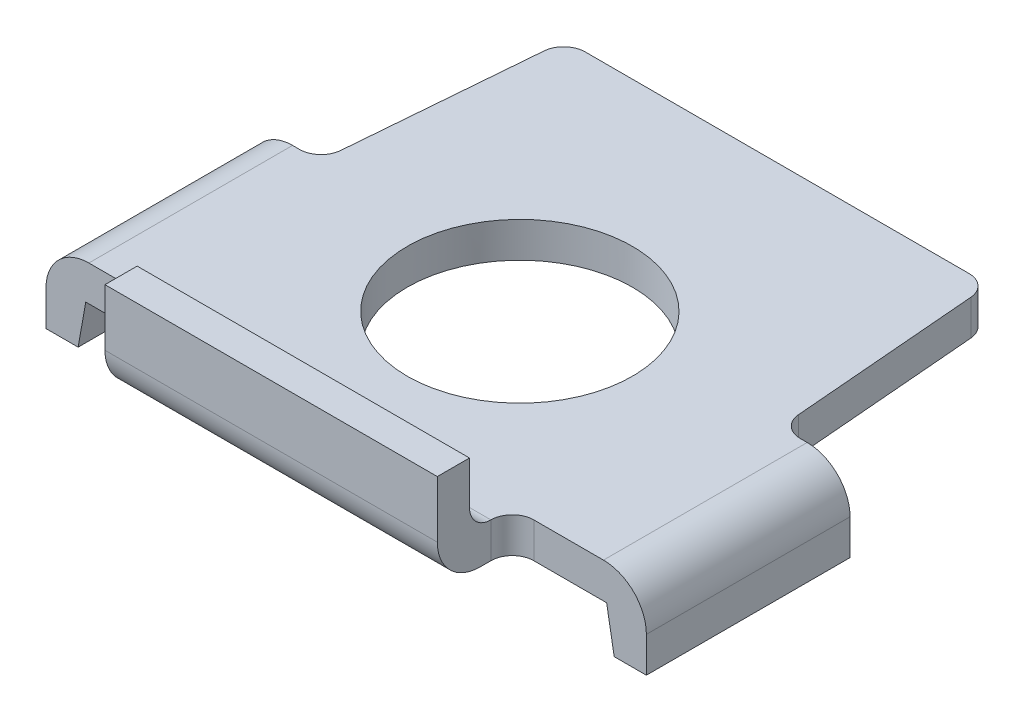
ISO-10303-21;
HEADER;
FILE_DESCRIPTION(('STEP AP214'),'2;1');
FILE_NAME('part.step','',(''),(''),'','','');
FILE_SCHEMA(('AUTOMOTIVE_DESIGN { 1 0 10303 214 1 1 1 1 }'));
ENDSEC;
DATA;
#1=APPLICATION_CONTEXT('core data for automotive mechanical design processes');
#2=APPLICATION_PROTOCOL_DEFINITION('international standard','automotive_design',2000,#1);
#3=PRODUCT_CONTEXT('',#1,'mechanical');
#4=PRODUCT('Part','Part','',(#3));
#5=PRODUCT_RELATED_PRODUCT_CATEGORY('part','',(#4));
#6=PRODUCT_DEFINITION_FORMATION('','',#4);
#7=PRODUCT_DEFINITION_CONTEXT('part definition',#1,'design');
#8=PRODUCT_DEFINITION('design','',#6,#7);
#9=PRODUCT_DEFINITION_SHAPE('','',#8);
#10=(LENGTH_UNIT() NAMED_UNIT(*) SI_UNIT(.MILLI.,.METRE.));
#11=(NAMED_UNIT(*) PLANE_ANGLE_UNIT() SI_UNIT($,.RADIAN.));
#12=(NAMED_UNIT(*) SI_UNIT($,.STERADIAN.) SOLID_ANGLE_UNIT());
#13=UNCERTAINTY_MEASURE_WITH_UNIT(LENGTH_MEASURE(1.E-05),#10,'distance_accuracy_value','');
#14=(GEOMETRIC_REPRESENTATION_CONTEXT(3) GLOBAL_UNCERTAINTY_ASSIGNED_CONTEXT((#13)) GLOBAL_UNIT_ASSIGNED_CONTEXT((#10,
#11,#12)) REPRESENTATION_CONTEXT('',''));
#15=CARTESIAN_POINT('',(0.,0.,0.));
#16=DIRECTION('',(0.,0.,1.));
#17=DIRECTION('',(1.,0.,0.));
#18=AXIS2_PLACEMENT_3D('',#15,#16,#17);
#19=CARTESIAN_POINT('',(0.,0.,0.));
#20=DIRECTION('',(0.,-1.,0.));
#21=DIRECTION('',(0.,0.,-1.));
#22=AXIS2_PLACEMENT_3D('',#19,#20,#21);
#23=PLANE('',#22);
#24=CARTESIAN_POINT('',(0.,0.,9.89913443976813));
#25=DIRECTION('',(0.,-1.,0.));
#26=DIRECTION('',(0.,0.,-1.));
#27=AXIS2_PLACEMENT_3D('',#24,#25,#26);
#28=CIRCLE('',#27,5.25);
#29=CARTESIAN_POINT('',(0.,0.,4.64913443976813));
#30=VERTEX_POINT('',#29);
#31=EDGE_CURVE('E241',#30,#30,#28,.T.);
#32=ORIENTED_EDGE('',*,*,#31,.F.);
#33=EDGE_LOOP('',(#32));
#34=FACE_BOUND('',#33,.T.);
#35=DIRECTION('',(-1.,0.,0.));
#36=VECTOR('',#35,1.);
#37=CARTESIAN_POINT('',(-9.875,0.,-2.10086556023187));
#38=LINE('',#37,#36);
#39=CARTESIAN_POINT('',(8.9541459363838,0.,-2.10086556023187));
#40=VERTEX_POINT('',#39);
#41=CARTESIAN_POINT('',(-8.95414593638381,0.,-2.10086556023187));
#42=VERTEX_POINT('',#41);
#43=EDGE_CURVE('E303',#40,#42,#38,.T.);
#44=ORIENTED_EDGE('',*,*,#43,.F.);
#45=CARTESIAN_POINT('',(8.9541459363838,0.,-1.10086556023187));
#46=DIRECTION('',(0.,-1.,0.));
#47=DIRECTION('',(0.,0.,-1.));
#48=AXIS2_PLACEMENT_3D('',#45,#46,#47);
#49=CIRCLE('',#48,1.);
#50=CARTESIAN_POINT('',(9.9507562321317,0.,-1.18313291955068));
#51=VERTEX_POINT('',#50);
#52=EDGE_CURVE('E409',#40,#51,#49,.T.);
#53=ORIENTED_EDGE('',*,*,#52,.T.);
#54=DIRECTION('',(-0.0822673593188121,0.,-0.996610295747897));
#55=VECTOR('',#54,1.);
#56=CARTESIAN_POINT('',(9.875,0.,-2.10086556023187));
#57=LINE('',#56,#55);
#58=CARTESIAN_POINT('',(10.6742437678683,0.,7.58140179908695));
#59=VERTEX_POINT('',#58);
#60=EDGE_CURVE('E301',#59,#51,#57,.T.);
#61=ORIENTED_EDGE('',*,*,#60,.F.);
#62=CARTESIAN_POINT('',(11.6708540636162,0.,7.49913443976813));
#63=DIRECTION('',(0.,-1.,0.));
#64=DIRECTION('',(0.,0.,-1.));
#65=AXIS2_PLACEMENT_3D('',#62,#63,#64);
#66=CIRCLE('',#65,1.);
#67=CARTESIAN_POINT('',(11.6708540636162,0.,8.49913443976813));
#68=VERTEX_POINT('',#67);
#69=EDGE_CURVE('E41',#59,#68,#66,.F.);
#70=ORIENTED_EDGE('',*,*,#69,.T.);
#71=DIRECTION('',(-1.,0.,0.));
#72=VECTOR('',#71,1.);
#73=CARTESIAN_POINT('',(10.75,0.,8.49913443976813));
#74=LINE('',#73,#72);
#75=CARTESIAN_POINT('',(12.1473460385831,0.,8.49913443976813));
#76=VERTEX_POINT('',#75);
#77=EDGE_CURVE('E299',#76,#68,#74,.T.);
#78=ORIENTED_EDGE('',*,*,#77,.F.);
#79=DIRECTION('',(0.,0.,1.));
#80=VECTOR('',#79,1.);
#81=CARTESIAN_POINT('',(12.1473460385831,0.,0.));
#82=LINE('',#81,#80);
#83=CARTESIAN_POINT('',(12.1473460385831,0.,17.9991344397681));
#84=VERTEX_POINT('',#83);
#85=EDGE_CURVE('E478',#76,#84,#82,.T.);
#86=ORIENTED_EDGE('',*,*,#85,.T.);
#87=DIRECTION('',(1.,0.,0.));
#88=VECTOR('',#87,1.);
#89=CARTESIAN_POINT('',(14.,0.,17.9991344397681));
#90=LINE('',#89,#88);
#91=CARTESIAN_POINT('',(8.75,0.,17.9991344397681));
#92=VERTEX_POINT('',#91);
#93=EDGE_CURVE('E297',#92,#84,#90,.T.);
#94=ORIENTED_EDGE('',*,*,#93,.F.);
#95=CARTESIAN_POINT('',(8.75,0.,18.9991344397681));
#96=DIRECTION('',(0.,-1.,0.));
#97=DIRECTION('',(0.,0.,-1.));
#98=AXIS2_PLACEMENT_3D('',#95,#96,#97);
#99=CIRCLE('',#98,1.);
#100=CARTESIAN_POINT('',(7.75,0.,18.9991344397681));
#101=VERTEX_POINT('',#100);
#102=EDGE_CURVE('E345',#92,#101,#99,.F.);
#103=ORIENTED_EDGE('',*,*,#102,.T.);
#104=DIRECTION('',(0.,0.,-1.));
#105=VECTOR('',#104,1.);
#106=CARTESIAN_POINT('',(7.75000000000001,0.,17.9991344397681));
#107=LINE('',#106,#105);
#108=CARTESIAN_POINT('',(7.75,0.,19.4991344397681));
#109=VERTEX_POINT('',#108);
#110=EDGE_CURVE('E293',#109,#101,#107,.T.);
#111=ORIENTED_EDGE('',*,*,#110,.F.);
#112=DIRECTION('',(1.,0.,0.));
#113=VECTOR('',#112,1.);
#114=CARTESIAN_POINT('',(-7.75,0.,19.4991344397681));
#115=LINE('',#114,#113);
#116=CARTESIAN_POINT('',(-7.75,0.,19.4991344397681));
#117=VERTEX_POINT('',#116);
#118=EDGE_CURVE('E376',#109,#117,#115,.F.);
#119=ORIENTED_EDGE('',*,*,#118,.T.);
#120=DIRECTION('',(0.,0.,1.));
#121=VECTOR('',#120,1.);
#122=CARTESIAN_POINT('',(-7.75000000000001,0.,17.9991344397681));
#123=LINE('',#122,#121);
#124=CARTESIAN_POINT('',(-7.75,0.,18.9991344397681));
#125=VERTEX_POINT('',#124);
#126=EDGE_CURVE('E291',#125,#117,#123,.T.);
#127=ORIENTED_EDGE('',*,*,#126,.F.);
#128=CARTESIAN_POINT('',(-8.75,0.,18.9991344397681));
#129=DIRECTION('',(0.,-1.,0.));
#130=DIRECTION('',(0.,0.,-1.));
#131=AXIS2_PLACEMENT_3D('',#128,#129,#130);
#132=CIRCLE('',#131,1.);
#133=CARTESIAN_POINT('',(-8.75,0.,17.9991344397681));
#134=VERTEX_POINT('',#133);
#135=EDGE_CURVE('E341',#125,#134,#132,.F.);
#136=ORIENTED_EDGE('',*,*,#135,.T.);
#137=DIRECTION('',(1.,0.,0.));
#138=VECTOR('',#137,1.);
#139=CARTESIAN_POINT('',(-14.,0.,17.9991344397681));
#140=LINE('',#139,#138);
#141=CARTESIAN_POINT('',(-12.1473460385831,0.,17.9991344397681));
#142=VERTEX_POINT('',#141);
#143=EDGE_CURVE('E276',#142,#134,#140,.T.);
#144=ORIENTED_EDGE('',*,*,#143,.F.);
#145=DIRECTION('',(0.,0.,-1.));
#146=VECTOR('',#145,1.);
#147=CARTESIAN_POINT('',(-12.1473460385831,0.,0.));
#148=LINE('',#147,#146);
#149=CARTESIAN_POINT('',(-12.1473460385831,0.,8.49913443976813));
#150=VERTEX_POINT('',#149);
#151=EDGE_CURVE('E451',#142,#150,#148,.T.);
#152=ORIENTED_EDGE('',*,*,#151,.T.);
#153=DIRECTION('',(-1.,0.,0.));
#154=VECTOR('',#153,1.);
#155=CARTESIAN_POINT('',(-10.75,0.,8.49913443976813));
#156=LINE('',#155,#154);
#157=CARTESIAN_POINT('',(-11.6708540636162,0.,8.49913443976813));
#158=VERTEX_POINT('',#157);
#159=EDGE_CURVE('E308',#158,#150,#156,.T.);
#160=ORIENTED_EDGE('',*,*,#159,.F.);
#161=CARTESIAN_POINT('',(-11.6708540636162,0.,7.49913443976813));
#162=DIRECTION('',(0.,-1.,0.));
#163=DIRECTION('',(0.,0.,-1.));
#164=AXIS2_PLACEMENT_3D('',#161,#162,#163);
#165=CIRCLE('',#164,1.);
#166=CARTESIAN_POINT('',(-10.6742437678683,0.,7.58140179908695));
#167=VERTEX_POINT('',#166);
#168=EDGE_CURVE('E337',#158,#167,#165,.F.);
#169=ORIENTED_EDGE('',*,*,#168,.T.);
#170=DIRECTION('',(-0.0822673593188121,0.,0.996610295747897));
#171=VECTOR('',#170,1.);
#172=CARTESIAN_POINT('',(-9.875,0.,-2.10086556023187));
#173=LINE('',#172,#171);
#174=CARTESIAN_POINT('',(-9.9507562321317,0.,-1.18313291955068));
#175=VERTEX_POINT('',#174);
#176=EDGE_CURVE('E305',#175,#167,#173,.T.);
#177=ORIENTED_EDGE('',*,*,#176,.F.);
#178=CARTESIAN_POINT('',(-8.95414593638381,0.,-1.10086556023187));
#179=DIRECTION('',(0.,-1.,0.));
#180=DIRECTION('',(0.,0.,-1.));
#181=AXIS2_PLACEMENT_3D('',#178,#179,#180);
#182=CIRCLE('',#181,1.);
#183=EDGE_CURVE('E398',#175,#42,#182,.T.);
#184=ORIENTED_EDGE('',*,*,#183,.T.);
#185=EDGE_LOOP('',(#44,#53,#61,#70,#78,#86,#94,#103,#111,#119,#127,#136,#144,#152,#160,#169,
#177,#184));
#186=FACE_BOUND('',#185,.T.);
#187=ADVANCED_FACE('F33',(#34,#186),#23,.T.);
#188=CARTESIAN_POINT('',(0.,1.65,0.));
#189=DIRECTION('',(0.,-1.,0.));
#190=DIRECTION('',(0.,0.,-1.));
#191=AXIS2_PLACEMENT_3D('',#188,#189,#190);
#192=PLANE('',#191);
#193=CARTESIAN_POINT('',(0.,1.65,9.89913443976813));
#194=DIRECTION('',(0.,1.,0.));
#195=DIRECTION('',(0.,0.,1.));
#196=AXIS2_PLACEMENT_3D('',#193,#194,#195);
#197=CIRCLE('',#196,5.25);
#198=CARTESIAN_POINT('',(0.,1.65,15.1491344397681));
#199=VERTEX_POINT('',#198);
#200=EDGE_CURVE('E244',#199,#199,#197,.T.);
#201=ORIENTED_EDGE('',*,*,#200,.F.);
#202=EDGE_LOOP('',(#201));
#203=FACE_BOUND('',#202,.T.);
#204=DIRECTION('',(-1.,0.,0.));
#205=VECTOR('',#204,1.);
#206=CARTESIAN_POINT('',(10.75,1.65,8.49913443976813));
#207=LINE('',#206,#205);
#208=CARTESIAN_POINT('',(12.,1.65,8.49913443976813));
#209=VERTEX_POINT('',#208);
#210=CARTESIAN_POINT('',(11.6708540636162,1.65,8.49913443976813));
#211=VERTEX_POINT('',#210);
#212=EDGE_CURVE('E275',#209,#211,#207,.T.);
#213=ORIENTED_EDGE('',*,*,#212,.T.);
#214=CARTESIAN_POINT('',(11.6708540636162,1.65,7.49913443976813));
#215=DIRECTION('',(0.,-1.,0.));
#216=DIRECTION('',(0.,0.,-1.));
#217=AXIS2_PLACEMENT_3D('',#214,#215,#216);
#218=CIRCLE('',#217,1.);
#219=CARTESIAN_POINT('',(10.6742437678683,1.65,7.58140179908695));
#220=VERTEX_POINT('',#219);
#221=EDGE_CURVE('E11',#211,#220,#218,.T.);
#222=ORIENTED_EDGE('',*,*,#221,.T.);
#223=DIRECTION('',(-0.0822673593188121,0.,-0.996610295747897));
#224=VECTOR('',#223,1.);
#225=CARTESIAN_POINT('',(9.875,1.65,-2.10086556023187));
#226=LINE('',#225,#224);
#227=CARTESIAN_POINT('',(9.9507562321317,1.65,-1.18313291955068));
#228=VERTEX_POINT('',#227);
#229=EDGE_CURVE('E278',#220,#228,#226,.T.);
#230=ORIENTED_EDGE('',*,*,#229,.T.);
#231=CARTESIAN_POINT('',(8.9541459363838,1.65,-1.10086556023187));
#232=DIRECTION('',(0.,-1.,0.));
#233=DIRECTION('',(0.,0.,-1.));
#234=AXIS2_PLACEMENT_3D('',#231,#232,#233);
#235=CIRCLE('',#234,1.);
#236=CARTESIAN_POINT('',(8.9541459363838,1.65,-2.10086556023187));
#237=VERTEX_POINT('',#236);
#238=EDGE_CURVE('E316',#228,#237,#235,.F.);
#239=ORIENTED_EDGE('',*,*,#238,.T.);
#240=DIRECTION('',(-1.,0.,0.));
#241=VECTOR('',#240,1.);
#242=CARTESIAN_POINT('',(-9.875,1.65,-2.10086556023187));
#243=LINE('',#242,#241);
#244=CARTESIAN_POINT('',(-8.95414593638381,1.65,-2.10086556023187));
#245=VERTEX_POINT('',#244);
#246=EDGE_CURVE('E280',#237,#245,#243,.T.);
#247=ORIENTED_EDGE('',*,*,#246,.T.);
#248=CARTESIAN_POINT('',(-8.95414593638381,1.65,-1.10086556023187));
#249=DIRECTION('',(0.,-1.,0.));
#250=DIRECTION('',(0.,0.,-1.));
#251=AXIS2_PLACEMENT_3D('',#248,#249,#250);
#252=CIRCLE('',#251,1.);
#253=CARTESIAN_POINT('',(-9.9507562321317,1.65,-1.18313291955068));
#254=VERTEX_POINT('',#253);
#255=EDGE_CURVE('E404',#245,#254,#252,.F.);
#256=ORIENTED_EDGE('',*,*,#255,.T.);
#257=DIRECTION('',(-0.0822673593188121,0.,0.996610295747897));
#258=VECTOR('',#257,1.);
#259=CARTESIAN_POINT('',(-9.875,1.65,-2.10086556023187));
#260=LINE('',#259,#258);
#261=CARTESIAN_POINT('',(-10.6742437678683,1.65,7.58140179908695));
#262=VERTEX_POINT('',#261);
#263=EDGE_CURVE('E282',#254,#262,#260,.T.);
#264=ORIENTED_EDGE('',*,*,#263,.T.);
#265=CARTESIAN_POINT('',(-11.6708540636162,1.65,7.49913443976813));
#266=DIRECTION('',(0.,-1.,0.));
#267=DIRECTION('',(0.,0.,-1.));
#268=AXIS2_PLACEMENT_3D('',#265,#266,#267);
#269=CIRCLE('',#268,1.);
#270=CARTESIAN_POINT('',(-11.6708540636162,1.65,8.49913443976813));
#271=VERTEX_POINT('',#270);
#272=EDGE_CURVE('E339',#262,#271,#269,.T.);
#273=ORIENTED_EDGE('',*,*,#272,.T.);
#274=DIRECTION('',(-1.,0.,0.));
#275=VECTOR('',#274,1.);
#276=CARTESIAN_POINT('',(-10.75,1.65,8.49913443976813));
#277=LINE('',#276,#275);
#278=CARTESIAN_POINT('',(-12.,1.65,8.49913443976813));
#279=VERTEX_POINT('',#278);
#280=EDGE_CURVE('E285',#271,#279,#277,.T.);
#281=ORIENTED_EDGE('',*,*,#280,.T.);
#282=DIRECTION('',(0.,0.,1.));
#283=VECTOR('',#282,1.);
#284=CARTESIAN_POINT('',(-12.,1.65,0.));
#285=LINE('',#284,#283);
#286=CARTESIAN_POINT('',(-12.,1.65,17.9991344397681));
#287=VERTEX_POINT('',#286);
#288=EDGE_CURVE('E454',#279,#287,#285,.T.);
#289=ORIENTED_EDGE('',*,*,#288,.T.);
#290=DIRECTION('',(1.,0.,0.));
#291=VECTOR('',#290,1.);
#292=CARTESIAN_POINT('',(-14.,1.65,17.9991344397681));
#293=LINE('',#292,#291);
#294=CARTESIAN_POINT('',(-8.75,1.65,17.9991344397681));
#295=VERTEX_POINT('',#294);
#296=EDGE_CURVE('E287',#287,#295,#293,.T.);
#297=ORIENTED_EDGE('',*,*,#296,.T.);
#298=CARTESIAN_POINT('',(-8.75,1.65,18.9991344397681));
#299=DIRECTION('',(0.,-1.,0.));
#300=DIRECTION('',(0.,0.,-1.));
#301=AXIS2_PLACEMENT_3D('',#298,#299,#300);
#302=CIRCLE('',#301,1.);
#303=CARTESIAN_POINT('',(-7.75,1.65,18.9991344397681));
#304=VERTEX_POINT('',#303);
#305=EDGE_CURVE('E343',#295,#304,#302,.T.);
#306=ORIENTED_EDGE('',*,*,#305,.T.);
#307=DIRECTION('',(-1.,0.,0.));
#308=VECTOR('',#307,1.);
#309=CARTESIAN_POINT('',(7.75,1.65,18.9991344397681));
#310=LINE('',#309,#308);
#311=CARTESIAN_POINT('',(7.75,1.65,18.9991344397681));
#312=VERTEX_POINT('',#311);
#313=EDGE_CURVE('E354',#304,#312,#310,.F.);
#314=ORIENTED_EDGE('',*,*,#313,.T.);
#315=CARTESIAN_POINT('',(8.75,1.65,18.9991344397681));
#316=DIRECTION('',(0.,-1.,0.));
#317=DIRECTION('',(0.,0.,-1.));
#318=AXIS2_PLACEMENT_3D('',#315,#316,#317);
#319=CIRCLE('',#318,1.);
#320=CARTESIAN_POINT('',(8.75,1.65,17.9991344397681));
#321=VERTEX_POINT('',#320);
#322=EDGE_CURVE('E347',#312,#321,#319,.T.);
#323=ORIENTED_EDGE('',*,*,#322,.T.);
#324=DIRECTION('',(1.,0.,0.));
#325=VECTOR('',#324,1.);
#326=CARTESIAN_POINT('',(14.,1.65,17.9991344397681));
#327=LINE('',#326,#325);
#328=CARTESIAN_POINT('',(12.,1.65,17.9991344397681));
#329=VERTEX_POINT('',#328);
#330=EDGE_CURVE('E273',#321,#329,#327,.T.);
#331=ORIENTED_EDGE('',*,*,#330,.T.);
#332=DIRECTION('',(0.,0.,-1.));
#333=VECTOR('',#332,1.);
#334=CARTESIAN_POINT('',(12.,1.65,0.));
#335=LINE('',#334,#333);
#336=EDGE_CURVE('E458',#329,#209,#335,.T.);
#337=ORIENTED_EDGE('',*,*,#336,.T.);
#338=EDGE_LOOP('',(#213,#222,#230,#239,#247,#256,#264,#273,#281,#289,#297,#306,#314,#323,#331,#337));
#339=FACE_BOUND('',#338,.T.);
#340=ADVANCED_FACE('F351',(#203,#339),#192,.F.);
#341=CARTESIAN_POINT('',(-7.75000000000001,1.65,17.9991344397681));
#342=DIRECTION('',(1.,0.,0.));
#343=DIRECTION('',(0.,0.,-1.));
#344=AXIS2_PLACEMENT_3D('',#341,#342,#343);
#345=PLANE('',#344);
#346=CARTESIAN_POINT('',(-7.75,2.65,18.9991344397681));
#347=DIRECTION('',(1.,0.,0.));
#348=DIRECTION('',(0.,0.,-1.));
#349=AXIS2_PLACEMENT_3D('',#346,#347,#348);
#350=CIRCLE('',#349,1.);
#351=CARTESIAN_POINT('',(-7.75,2.65,19.9991344397681));
#352=VERTEX_POINT('',#351);
#353=EDGE_CURVE('E390',#352,#304,#350,.T.);
#354=ORIENTED_EDGE('',*,*,#353,.T.);
#355=DIRECTION('',(0.,-1.,0.));
#356=VECTOR('',#355,1.);
#357=CARTESIAN_POINT('',(-7.75,0.,18.9991344397681));
#358=LINE('',#357,#356);
#359=EDGE_CURVE('E323',#304,#125,#358,.T.);
#360=ORIENTED_EDGE('',*,*,#359,.T.);
#361=ORIENTED_EDGE('',*,*,#126,.T.);
#362=CARTESIAN_POINT('',(-7.75000000000001,2.,19.4991344397681));
#363=DIRECTION('',(1.,0.,0.));
#364=DIRECTION('',(0.,0.,-1.));
#365=AXIS2_PLACEMENT_3D('',#362,#363,#364);
#366=CIRCLE('',#365,2.);
#367=CARTESIAN_POINT('',(-7.75,2.,21.4991344397681));
#368=VERTEX_POINT('',#367);
#369=EDGE_CURVE('E379',#117,#368,#366,.F.);
#370=ORIENTED_EDGE('',*,*,#369,.T.);
#371=DIRECTION('',(0.,-1.,0.));
#372=VECTOR('',#371,1.);
#373=CARTESIAN_POINT('',(-7.75,1.65,21.4991344397681));
#374=LINE('',#373,#372);
#375=CARTESIAN_POINT('',(-7.75,4.65,21.4991344397681));
#376=VERTEX_POINT('',#375);
#377=EDGE_CURVE('E459',#376,#368,#374,.T.);
#378=ORIENTED_EDGE('',*,*,#377,.F.);
#379=DIRECTION('',(0.,0.,1.));
#380=VECTOR('',#379,1.);
#381=CARTESIAN_POINT('',(-7.75,4.65,21.4991344397681));
#382=LINE('',#381,#380);
#383=CARTESIAN_POINT('',(-7.75,4.65,19.9991344397681));
#384=VERTEX_POINT('',#383);
#385=EDGE_CURVE('E262',#384,#376,#382,.T.);
#386=ORIENTED_EDGE('',*,*,#385,.F.);
#387=DIRECTION('',(0.,-1.,0.));
#388=VECTOR('',#387,1.);
#389=CARTESIAN_POINT('',(-7.75,4.65,19.9991344397681));
#390=LINE('',#389,#388);
#391=EDGE_CURVE('E272',#384,#352,#390,.T.);
#392=ORIENTED_EDGE('',*,*,#391,.T.);
#393=EDGE_LOOP('',(#354,#360,#361,#370,#378,#386,#392));
#394=FACE_BOUND('',#393,.T.);
#395=ADVANCED_FACE('F503',(#394),#345,.F.);
#396=CARTESIAN_POINT('',(7.75,1.65,21.4991344397681));
#397=DIRECTION('',(0.,0.,-1.));
#398=DIRECTION('',(-1.,0.,0.));
#399=AXIS2_PLACEMENT_3D('',#396,#397,#398);
#400=PLANE('',#399);
#401=ORIENTED_EDGE('',*,*,#377,.T.);
#402=DIRECTION('',(1.,0.,0.));
#403=VECTOR('',#402,1.);
#404=CARTESIAN_POINT('',(7.75,2.,21.4991344397681));
#405=LINE('',#404,#403);
#406=CARTESIAN_POINT('',(7.75,2.,21.4991344397681));
#407=VERTEX_POINT('',#406);
#408=EDGE_CURVE('E377',#368,#407,#405,.T.);
#409=ORIENTED_EDGE('',*,*,#408,.T.);
#410=DIRECTION('',(0.,-1.,0.));
#411=VECTOR('',#410,1.);
#412=CARTESIAN_POINT('',(7.75,1.65,21.4991344397681));
#413=LINE('',#412,#411);
#414=CARTESIAN_POINT('',(7.75,4.65,21.4991344397681));
#415=VERTEX_POINT('',#414);
#416=EDGE_CURVE('E223',#415,#407,#413,.T.);
#417=ORIENTED_EDGE('',*,*,#416,.F.);
#418=DIRECTION('',(1.,0.,0.));
#419=VECTOR('',#418,1.);
#420=CARTESIAN_POINT('',(-7.75,4.65,21.4991344397681));
#421=LINE('',#420,#419);
#422=EDGE_CURVE('E265',#376,#415,#421,.T.);
#423=ORIENTED_EDGE('',*,*,#422,.F.);
#424=EDGE_LOOP('',(#401,#409,#417,#423));
#425=FACE_BOUND('',#424,.T.);
#426=ADVANCED_FACE('F615',(#425),#400,.F.);
#427=CARTESIAN_POINT('',(7.75000000000001,1.65,17.9991344397681));
#428=DIRECTION('',(-1.,0.,0.));
#429=DIRECTION('',(0.,0.,1.));
#430=AXIS2_PLACEMENT_3D('',#427,#428,#429);
#431=PLANE('',#430);
#432=ORIENTED_EDGE('',*,*,#110,.T.);
#433=DIRECTION('',(0.,-1.,0.));
#434=VECTOR('',#433,1.);
#435=CARTESIAN_POINT('',(7.75,1.65,18.9991344397681));
#436=LINE('',#435,#434);
#437=EDGE_CURVE('E331',#101,#312,#436,.F.);
#438=ORIENTED_EDGE('',*,*,#437,.T.);
#439=CARTESIAN_POINT('',(7.75000000000001,2.65,18.9991344397681));
#440=DIRECTION('',(-1.,0.,0.));
#441=DIRECTION('',(0.,0.,1.));
#442=AXIS2_PLACEMENT_3D('',#439,#440,#441);
#443=CIRCLE('',#442,1.);
#444=CARTESIAN_POINT('',(7.75,2.65,19.9991344397681));
#445=VERTEX_POINT('',#444);
#446=EDGE_CURVE('E393',#312,#445,#443,.T.);
#447=ORIENTED_EDGE('',*,*,#446,.T.);
#448=DIRECTION('',(0.,-1.,0.));
#449=VECTOR('',#448,1.);
#450=CARTESIAN_POINT('',(7.75,4.65,19.9991344397681));
#451=LINE('',#450,#449);
#452=CARTESIAN_POINT('',(7.75,4.65,19.9991344397681));
#453=VERTEX_POINT('',#452);
#454=EDGE_CURVE('E294',#453,#445,#451,.T.);
#455=ORIENTED_EDGE('',*,*,#454,.F.);
#456=DIRECTION('',(0.,0.,-1.));
#457=VECTOR('',#456,1.);
#458=CARTESIAN_POINT('',(7.75,4.65,21.4991344397681));
#459=LINE('',#458,#457);
#460=EDGE_CURVE('E268',#415,#453,#459,.T.);
#461=ORIENTED_EDGE('',*,*,#460,.F.);
#462=ORIENTED_EDGE('',*,*,#416,.T.);
#463=CARTESIAN_POINT('',(7.75,2.,19.4991344397681));
#464=DIRECTION('',(-1.,0.,0.));
#465=DIRECTION('',(0.,0.,1.));
#466=AXIS2_PLACEMENT_3D('',#463,#464,#465);
#467=CIRCLE('',#466,2.);
#468=EDGE_CURVE('E371',#407,#109,#467,.F.);
#469=ORIENTED_EDGE('',*,*,#468,.T.);
#470=EDGE_LOOP('',(#432,#438,#447,#455,#461,#462,#469));
#471=FACE_BOUND('',#470,.T.);
#472=ADVANCED_FACE('F369',(#471),#431,.F.);
#473=CARTESIAN_POINT('',(14.,1.65,17.9991344397681));
#474=DIRECTION('',(0.,0.,-1.));
#475=DIRECTION('',(-1.,0.,0.));
#476=AXIS2_PLACEMENT_3D('',#473,#474,#475);
#477=PLANE('',#476);
#478=ORIENTED_EDGE('',*,*,#330,.F.);
#479=DIRECTION('',(0.,-1.,0.));
#480=VECTOR('',#479,1.);
#481=CARTESIAN_POINT('',(8.75,0.,17.9991344397681));
#482=LINE('',#481,#480);
#483=EDGE_CURVE('E328',#321,#92,#482,.T.);
#484=ORIENTED_EDGE('',*,*,#483,.T.);
#485=ORIENTED_EDGE('',*,*,#93,.T.);
#486=DIRECTION('',(0.173648177666934,-0.984807753012208,0.));
#487=VECTOR('',#486,1.);
#488=CARTESIAN_POINT('',(11.9210437728412,1.28342392544002,17.9991344397681));
#489=LINE('',#488,#487);
#490=CARTESIAN_POINT('',(12.5,-2.,17.9991344397681));
#491=VERTEX_POINT('',#490);
#492=EDGE_CURVE('E231',#84,#491,#489,.T.);
#493=ORIENTED_EDGE('',*,*,#492,.T.);
#494=DIRECTION('',(-1.,0.,0.));
#495=VECTOR('',#494,1.);
#496=CARTESIAN_POINT('',(14.,-2.,17.9991344397681));
#497=LINE('',#496,#495);
#498=CARTESIAN_POINT('',(14.,-2.,17.9991344397681));
#499=VERTEX_POINT('',#498);
#500=EDGE_CURVE('E227',#499,#491,#497,.T.);
#501=ORIENTED_EDGE('',*,*,#500,.F.);
#502=DIRECTION('',(0.,-1.,0.));
#503=VECTOR('',#502,1.);
#504=CARTESIAN_POINT('',(14.,1.65,17.9991344397681));
#505=LINE('',#504,#503);
#506=CARTESIAN_POINT('',(14.,-0.35,17.9991344397681));
#507=VERTEX_POINT('',#506);
#508=EDGE_CURVE('E212',#507,#499,#505,.T.);
#509=ORIENTED_EDGE('',*,*,#508,.F.);
#510=CARTESIAN_POINT('',(12.,-0.35,17.9991344397681));
#511=DIRECTION('',(0.,0.,-1.));
#512=DIRECTION('',(-1.,0.,0.));
#513=AXIS2_PLACEMENT_3D('',#510,#511,#512);
#514=CIRCLE('',#513,2.);
#515=EDGE_CURVE('E360',#507,#329,#514,.F.);
#516=ORIENTED_EDGE('',*,*,#515,.T.);
#517=EDGE_LOOP('',(#478,#484,#485,#493,#501,#509,#516));
#518=FACE_BOUND('',#517,.T.);
#519=ADVANCED_FACE('F229',(#518),#477,.F.);
#520=CARTESIAN_POINT('',(14.,1.65,8.49913443976813));
#521=DIRECTION('',(-1.,0.,0.));
#522=DIRECTION('',(0.,0.,1.));
#523=AXIS2_PLACEMENT_3D('',#520,#521,#522);
#524=PLANE('',#523);
#525=DIRECTION('',(0.,-1.,0.));
#526=VECTOR('',#525,1.);
#527=CARTESIAN_POINT('',(14.,1.65,8.49913443976813));
#528=LINE('',#527,#526);
#529=CARTESIAN_POINT('',(14.,-0.35,8.49913443976813));
#530=VERTEX_POINT('',#529);
#531=CARTESIAN_POINT('',(14.,-2.,8.49913443976813));
#532=VERTEX_POINT('',#531);
#533=EDGE_CURVE('E224',#530,#532,#528,.T.);
#534=ORIENTED_EDGE('',*,*,#533,.F.);
#535=DIRECTION('',(0.,0.,-1.));
#536=VECTOR('',#535,1.);
#537=CARTESIAN_POINT('',(14.,-0.35,8.49913443976813));
#538=LINE('',#537,#536);
#539=EDGE_CURVE('E219',#530,#507,#538,.F.);
#540=ORIENTED_EDGE('',*,*,#539,.T.);
#541=ORIENTED_EDGE('',*,*,#508,.T.);
#542=DIRECTION('',(0.,0.,1.));
#543=VECTOR('',#542,1.);
#544=CARTESIAN_POINT('',(14.,-2.,17.9991344397681));
#545=LINE('',#544,#543);
#546=EDGE_CURVE('E217',#532,#499,#545,.T.);
#547=ORIENTED_EDGE('',*,*,#546,.F.);
#548=EDGE_LOOP('',(#534,#540,#541,#547));
#549=FACE_BOUND('',#548,.T.);
#550=ADVANCED_FACE('F215',(#549),#524,.F.);
#551=CARTESIAN_POINT('',(10.75,1.65,8.49913443976813));
#552=DIRECTION('',(0.,0.,1.));
#553=DIRECTION('',(1.,0.,0.));
#554=AXIS2_PLACEMENT_3D('',#551,#552,#553);
#555=PLANE('',#554);
#556=ORIENTED_EDGE('',*,*,#77,.T.);
#557=DIRECTION('',(0.,-1.,0.));
#558=VECTOR('',#557,1.);
#559=CARTESIAN_POINT('',(11.6708540636162,1.65,8.49913443976813));
#560=LINE('',#559,#558);
#561=EDGE_CURVE('E54',#68,#211,#560,.F.);
#562=ORIENTED_EDGE('',*,*,#561,.T.);
#563=ORIENTED_EDGE('',*,*,#212,.F.);
#564=CARTESIAN_POINT('',(12.,-0.35,8.49913443976813));
#565=DIRECTION('',(0.,0.,1.));
#566=DIRECTION('',(1.,0.,0.));
#567=AXIS2_PLACEMENT_3D('',#564,#565,#566);
#568=CIRCLE('',#567,2.);
#569=EDGE_CURVE('E461',#209,#530,#568,.F.);
#570=ORIENTED_EDGE('',*,*,#569,.T.);
#571=ORIENTED_EDGE('',*,*,#533,.T.);
#572=DIRECTION('',(1.,0.,0.));
#573=VECTOR('',#572,1.);
#574=CARTESIAN_POINT('',(14.,-2.,8.49913443976813));
#575=LINE('',#574,#573);
#576=CARTESIAN_POINT('',(12.5,-2.,8.49913443976813));
#577=VERTEX_POINT('',#576);
#578=EDGE_CURVE('E240',#577,#532,#575,.T.);
#579=ORIENTED_EDGE('',*,*,#578,.F.);
#580=DIRECTION('',(-0.173648177666934,0.984807753012208,0.));
#581=VECTOR('',#580,1.);
#582=CARTESIAN_POINT('',(11.8230442816183,1.83920665834425,8.49913443976813));
#583=LINE('',#582,#581);
#584=EDGE_CURVE('E480',#577,#76,#583,.T.);
#585=ORIENTED_EDGE('',*,*,#584,.T.);
#586=EDGE_LOOP('',(#556,#562,#563,#570,#571,#579,#585));
#587=FACE_BOUND('',#586,.T.);
#588=ADVANCED_FACE('F600',(#587),#555,.F.);
#589=CARTESIAN_POINT('',(9.875,1.65,-2.10086556023187));
#590=DIRECTION('',(-0.996610295747897,0.,0.0822673593188121));
#591=DIRECTION('',(0.0822673593188121,0.,0.996610295747896));
#592=AXIS2_PLACEMENT_3D('',#589,#590,#591);
#593=PLANE('',#592);
#594=ORIENTED_EDGE('',*,*,#229,.F.);
#595=DIRECTION('',(0.,-1.,0.));
#596=VECTOR('',#595,1.);
#597=CARTESIAN_POINT('',(10.6742437678683,0.,7.58140179908694));
#598=LINE('',#597,#596);
#599=EDGE_CURVE('E333',#220,#59,#598,.T.);
#600=ORIENTED_EDGE('',*,*,#599,.T.);
#601=ORIENTED_EDGE('',*,*,#60,.T.);
#602=DIRECTION('',(0.,-1.,0.));
#603=VECTOR('',#602,1.);
#604=CARTESIAN_POINT('',(9.9507562321317,1.65,-1.18313291955068));
#605=LINE('',#604,#603);
#606=EDGE_CURVE('E411',#51,#228,#605,.F.);
#607=ORIENTED_EDGE('',*,*,#606,.T.);
#608=EDGE_LOOP('',(#594,#600,#601,#607));
#609=FACE_BOUND('',#608,.T.);
#610=ADVANCED_FACE('F598',(#609),#593,.F.);
#611=CARTESIAN_POINT('',(-9.875,1.65,-2.10086556023187));
#612=DIRECTION('',(0.,0.,1.));
#613=DIRECTION('',(1.,0.,0.));
#614=AXIS2_PLACEMENT_3D('',#611,#612,#613);
#615=PLANE('',#614);
#616=ORIENTED_EDGE('',*,*,#246,.F.);
#617=DIRECTION('',(0.,-1.,0.));
#618=VECTOR('',#617,1.);
#619=CARTESIAN_POINT('',(8.9541459363838,1.65,-2.10086556023187));
#620=LINE('',#619,#618);
#621=EDGE_CURVE('E406',#237,#40,#620,.T.);
#622=ORIENTED_EDGE('',*,*,#621,.T.);
#623=ORIENTED_EDGE('',*,*,#43,.T.);
#624=DIRECTION('',(0.,-1.,0.));
#625=VECTOR('',#624,1.);
#626=CARTESIAN_POINT('',(-8.95414593638381,1.65,-2.10086556023187));
#627=LINE('',#626,#625);
#628=EDGE_CURVE('E401',#42,#245,#627,.F.);
#629=ORIENTED_EDGE('',*,*,#628,.T.);
#630=EDGE_LOOP('',(#616,#622,#623,#629));
#631=FACE_BOUND('',#630,.T.);
#632=ADVANCED_FACE('F421',(#631),#615,.F.);
#633=CARTESIAN_POINT('',(-9.875,1.65,-2.10086556023187));
#634=DIRECTION('',(0.996610295747897,0.,0.0822673593188121));
#635=DIRECTION('',(0.0822673593188121,0.,-0.996610295747896));
#636=AXIS2_PLACEMENT_3D('',#633,#634,#635);
#637=PLANE('',#636);
#638=ORIENTED_EDGE('',*,*,#176,.T.);
#639=DIRECTION('',(0.,-1.,0.));
#640=VECTOR('',#639,1.);
#641=CARTESIAN_POINT('',(-10.6742437678683,1.65,7.58140179908694));
#642=LINE('',#641,#640);
#643=EDGE_CURVE('E321',#167,#262,#642,.F.);
#644=ORIENTED_EDGE('',*,*,#643,.T.);
#645=ORIENTED_EDGE('',*,*,#263,.F.);
#646=DIRECTION('',(0.,-1.,0.));
#647=VECTOR('',#646,1.);
#648=CARTESIAN_POINT('',(-9.9507562321317,1.65,-1.18313291955068));
#649=LINE('',#648,#647);
#650=EDGE_CURVE('E395',#254,#175,#649,.T.);
#651=ORIENTED_EDGE('',*,*,#650,.T.);
#652=EDGE_LOOP('',(#638,#644,#645,#651));
#653=FACE_BOUND('',#652,.T.);
#654=ADVANCED_FACE('F432',(#653),#637,.F.);
#655=CARTESIAN_POINT('',(-10.75,1.65,8.49913443976813));
#656=DIRECTION('',(0.,0.,1.));
#657=DIRECTION('',(1.,0.,0.));
#658=AXIS2_PLACEMENT_3D('',#655,#656,#657);
#659=PLANE('',#658);
#660=ORIENTED_EDGE('',*,*,#280,.F.);
#661=DIRECTION('',(0.,-1.,0.));
#662=VECTOR('',#661,1.);
#663=CARTESIAN_POINT('',(-11.6708540636162,0.,8.49913443976813));
#664=LINE('',#663,#662);
#665=EDGE_CURVE('E318',#271,#158,#664,.T.);
#666=ORIENTED_EDGE('',*,*,#665,.T.);
#667=ORIENTED_EDGE('',*,*,#159,.T.);
#668=DIRECTION('',(-0.173648177666934,-0.984807753012207,0.));
#669=VECTOR('',#668,1.);
#670=CARTESIAN_POINT('',(-11.8230442816183,1.83920665834425,8.49913443976813));
#671=LINE('',#670,#669);
#672=CARTESIAN_POINT('',(-12.5,-2.,8.49913443976813));
#673=VERTEX_POINT('',#672);
#674=EDGE_CURVE('E381',#150,#673,#671,.T.);
#675=ORIENTED_EDGE('',*,*,#674,.T.);
#676=DIRECTION('',(1.,0.,0.));
#677=VECTOR('',#676,1.);
#678=CARTESIAN_POINT('',(-14.,-2.,8.49913443976813));
#679=LINE('',#678,#677);
#680=CARTESIAN_POINT('',(-14.,-2.,8.49913443976813));
#681=VERTEX_POINT('',#680);
#682=EDGE_CURVE('E253',#681,#673,#679,.T.);
#683=ORIENTED_EDGE('',*,*,#682,.F.);
#684=DIRECTION('',(0.,-1.,0.));
#685=VECTOR('',#684,1.);
#686=CARTESIAN_POINT('',(-14.,1.65,8.49913443976813));
#687=LINE('',#686,#685);
#688=CARTESIAN_POINT('',(-14.,-0.35,8.49913443976813));
#689=VERTEX_POINT('',#688);
#690=EDGE_CURVE('E448',#689,#681,#687,.T.);
#691=ORIENTED_EDGE('',*,*,#690,.F.);
#692=CARTESIAN_POINT('',(-12.,-0.35,8.49913443976813));
#693=DIRECTION('',(0.,0.,1.));
#694=DIRECTION('',(1.,0.,0.));
#695=AXIS2_PLACEMENT_3D('',#692,#693,#694);
#696=CIRCLE('',#695,2.);
#697=EDGE_CURVE('E445',#689,#279,#696,.F.);
#698=ORIENTED_EDGE('',*,*,#697,.T.);
#699=EDGE_LOOP('',(#660,#666,#667,#675,#683,#691,#698));
#700=FACE_BOUND('',#699,.T.);
#701=ADVANCED_FACE('F441',(#700),#659,.F.);
#702=CARTESIAN_POINT('',(-14.,1.65,8.49913443976813));
#703=DIRECTION('',(1.,0.,0.));
#704=DIRECTION('',(0.,0.,-1.));
#705=AXIS2_PLACEMENT_3D('',#702,#703,#704);
#706=PLANE('',#705);
#707=DIRECTION('',(0.,-1.,0.));
#708=VECTOR('',#707,1.);
#709=CARTESIAN_POINT('',(-14.,1.65,17.9991344397681));
#710=LINE('',#709,#708);
#711=CARTESIAN_POINT('',(-14.,-0.35,17.9991344397681));
#712=VERTEX_POINT('',#711);
#713=CARTESIAN_POINT('',(-14.,-2.,17.9991344397681));
#714=VERTEX_POINT('',#713);
#715=EDGE_CURVE('E290',#712,#714,#710,.T.);
#716=ORIENTED_EDGE('',*,*,#715,.F.);
#717=DIRECTION('',(0.,0.,1.));
#718=VECTOR('',#717,1.);
#719=CARTESIAN_POINT('',(-14.,-0.35,8.49913443976813));
#720=LINE('',#719,#718);
#721=EDGE_CURVE('E452',#712,#689,#720,.F.);
#722=ORIENTED_EDGE('',*,*,#721,.T.);
#723=ORIENTED_EDGE('',*,*,#690,.T.);
#724=DIRECTION('',(0.,0.,-1.));
#725=VECTOR('',#724,1.);
#726=CARTESIAN_POINT('',(-14.,-2.,17.9991344397681));
#727=LINE('',#726,#725);
#728=EDGE_CURVE('E250',#714,#681,#727,.T.);
#729=ORIENTED_EDGE('',*,*,#728,.F.);
#730=EDGE_LOOP('',(#716,#722,#723,#729));
#731=FACE_BOUND('',#730,.T.);
#732=ADVANCED_FACE('F523',(#731),#706,.F.);
#733=CARTESIAN_POINT('',(-14.,1.65,17.9991344397681));
#734=DIRECTION('',(0.,0.,-1.));
#735=DIRECTION('',(-1.,0.,0.));
#736=AXIS2_PLACEMENT_3D('',#733,#734,#735);
#737=PLANE('',#736);
#738=ORIENTED_EDGE('',*,*,#143,.T.);
#739=DIRECTION('',(0.,-1.,0.));
#740=VECTOR('',#739,1.);
#741=CARTESIAN_POINT('',(-8.75,1.65,17.9991344397681));
#742=LINE('',#741,#740);
#743=EDGE_CURVE('E326',#134,#295,#742,.F.);
#744=ORIENTED_EDGE('',*,*,#743,.T.);
#745=ORIENTED_EDGE('',*,*,#296,.F.);
#746=CARTESIAN_POINT('',(-12.,-0.35,17.9991344397681));
#747=DIRECTION('',(0.,0.,-1.));
#748=DIRECTION('',(-1.,0.,0.));
#749=AXIS2_PLACEMENT_3D('',#746,#747,#748);
#750=CIRCLE('',#749,2.);
#751=EDGE_CURVE('E456',#287,#712,#750,.F.);
#752=ORIENTED_EDGE('',*,*,#751,.T.);
#753=ORIENTED_EDGE('',*,*,#715,.T.);
#754=DIRECTION('',(-1.,0.,0.));
#755=VECTOR('',#754,1.);
#756=CARTESIAN_POINT('',(-14.,-2.,17.9991344397681));
#757=LINE('',#756,#755);
#758=CARTESIAN_POINT('',(-12.5,-2.,17.9991344397681));
#759=VERTEX_POINT('',#758);
#760=EDGE_CURVE('E259',#759,#714,#757,.T.);
#761=ORIENTED_EDGE('',*,*,#760,.F.);
#762=DIRECTION('',(0.173648177666934,0.984807753012207,0.));
#763=VECTOR('',#762,1.);
#764=CARTESIAN_POINT('',(-11.9210437728412,1.28342392544002,17.9991344397681));
#765=LINE('',#764,#763);
#766=EDGE_CURVE('E483',#759,#142,#765,.T.);
#767=ORIENTED_EDGE('',*,*,#766,.T.);
#768=EDGE_LOOP('',(#738,#744,#745,#752,#753,#761,#767));
#769=FACE_BOUND('',#768,.T.);
#770=ADVANCED_FACE('F495',(#769),#737,.F.);
#771=CARTESIAN_POINT('',(-7.75,4.65,19.9991344397681));
#772=DIRECTION('',(0.,0.,1.));
#773=DIRECTION('',(1.,0.,0.));
#774=AXIS2_PLACEMENT_3D('',#771,#772,#773);
#775=PLANE('',#774);
#776=ORIENTED_EDGE('',*,*,#454,.T.);
#777=DIRECTION('',(-1.,0.,0.));
#778=VECTOR('',#777,1.);
#779=CARTESIAN_POINT('',(-7.75,2.65,19.9991344397681));
#780=LINE('',#779,#778);
#781=EDGE_CURVE('E386',#445,#352,#780,.T.);
#782=ORIENTED_EDGE('',*,*,#781,.T.);
#783=ORIENTED_EDGE('',*,*,#391,.F.);
#784=DIRECTION('',(-1.,0.,0.));
#785=VECTOR('',#784,1.);
#786=CARTESIAN_POINT('',(-7.75,4.65,19.9991344397681));
#787=LINE('',#786,#785);
#788=EDGE_CURVE('E270',#453,#384,#787,.T.);
#789=ORIENTED_EDGE('',*,*,#788,.F.);
#790=EDGE_LOOP('',(#776,#782,#783,#789));
#791=FACE_BOUND('',#790,.T.);
#792=ADVANCED_FACE('F514',(#791),#775,.F.);
#793=CARTESIAN_POINT('',(0.,4.65,0.));
#794=DIRECTION('',(0.,-1.,0.));
#795=DIRECTION('',(0.,0.,-1.));
#796=AXIS2_PLACEMENT_3D('',#793,#794,#795);
#797=PLANE('',#796);
#798=ORIENTED_EDGE('',*,*,#385,.T.);
#799=ORIENTED_EDGE('',*,*,#422,.T.);
#800=ORIENTED_EDGE('',*,*,#460,.T.);
#801=ORIENTED_EDGE('',*,*,#788,.T.);
#802=EDGE_LOOP('',(#798,#799,#800,#801));
#803=FACE_BOUND('',#802,.T.);
#804=ADVANCED_FACE('F544',(#803),#797,.F.);
#805=CARTESIAN_POINT('',(0.,-2.,0.));
#806=DIRECTION('',(0.,-1.,0.));
#807=DIRECTION('',(0.,0.,-1.));
#808=AXIS2_PLACEMENT_3D('',#805,#806,#807);
#809=PLANE('',#808);
#810=ORIENTED_EDGE('',*,*,#728,.T.);
#811=ORIENTED_EDGE('',*,*,#682,.T.);
#812=DIRECTION('',(0.,0.,1.));
#813=VECTOR('',#812,1.);
#814=CARTESIAN_POINT('',(-12.5,-2.,17.9991344397681));
#815=LINE('',#814,#813);
#816=EDGE_CURVE('E256',#673,#759,#815,.T.);
#817=ORIENTED_EDGE('',*,*,#816,.T.);
#818=ORIENTED_EDGE('',*,*,#760,.T.);
#819=EDGE_LOOP('',(#810,#811,#817,#818));
#820=FACE_BOUND('',#819,.T.);
#821=ADVANCED_FACE('F489',(#820),#809,.T.);
#822=CARTESIAN_POINT('',(0.,-2.,0.));
#823=DIRECTION('',(0.,1.,0.));
#824=DIRECTION('',(0.,0.,1.));
#825=AXIS2_PLACEMENT_3D('',#822,#823,#824);
#826=PLANE('',#825);
#827=ORIENTED_EDGE('',*,*,#546,.T.);
#828=ORIENTED_EDGE('',*,*,#500,.T.);
#829=DIRECTION('',(0.,0.,-1.));
#830=VECTOR('',#829,1.);
#831=CARTESIAN_POINT('',(12.5,-2.,17.9991344397681));
#832=LINE('',#831,#830);
#833=EDGE_CURVE('E235',#491,#577,#832,.T.);
#834=ORIENTED_EDGE('',*,*,#833,.T.);
#835=ORIENTED_EDGE('',*,*,#578,.T.);
#836=EDGE_LOOP('',(#827,#828,#834,#835));
#837=FACE_BOUND('',#836,.T.);
#838=ADVANCED_FACE('F238',(#837),#826,.F.);
#839=CARTESIAN_POINT('',(0.,-2.000025,9.89913443976813));
#840=DIRECTION('',(0.,1.,0.));
#841=DIRECTION('',(0.,0.,1.));
#842=AXIS2_PLACEMENT_3D('',#839,#840,#841);
#843=CYLINDRICAL_SURFACE('',#842,5.25);
#844=ORIENTED_EDGE('',*,*,#31,.T.);
#845=EDGE_LOOP('',(#844));
#846=FACE_BOUND('',#845,.T.);
#847=ORIENTED_EDGE('',*,*,#200,.T.);
#848=EDGE_LOOP('',(#847));
#849=FACE_BOUND('',#848,.T.);
#850=ADVANCED_FACE('F552',(#846,#849),#843,.F.);
#851=CARTESIAN_POINT('',(12.,-0.35,0.));
#852=DIRECTION('',(0.,0.,-1.));
#853=DIRECTION('',(-1.,0.,0.));
#854=AXIS2_PLACEMENT_3D('',#851,#852,#853);
#855=CYLINDRICAL_SURFACE('',#854,2.);
#856=ORIENTED_EDGE('',*,*,#515,.F.);
#857=ORIENTED_EDGE('',*,*,#539,.F.);
#858=ORIENTED_EDGE('',*,*,#569,.F.);
#859=ORIENTED_EDGE('',*,*,#336,.F.);
#860=EDGE_LOOP('',(#856,#857,#858,#859));
#861=FACE_BOUND('',#860,.T.);
#862=ADVANCED_FACE('F554',(#861),#855,.T.);
#863=CARTESIAN_POINT('',(-12.,-0.35,0.));
#864=DIRECTION('',(0.,0.,1.));
#865=DIRECTION('',(1.,0.,0.));
#866=AXIS2_PLACEMENT_3D('',#863,#864,#865);
#867=CYLINDRICAL_SURFACE('',#866,2.);
#868=ORIENTED_EDGE('',*,*,#697,.F.);
#869=ORIENTED_EDGE('',*,*,#721,.F.);
#870=ORIENTED_EDGE('',*,*,#751,.F.);
#871=ORIENTED_EDGE('',*,*,#288,.F.);
#872=EDGE_LOOP('',(#868,#869,#870,#871));
#873=FACE_BOUND('',#872,.T.);
#874=ADVANCED_FACE('F455',(#873),#867,.T.);
#875=CARTESIAN_POINT('',(12.5,-1.99999999999996,17.9991344397681));
#876=DIRECTION('',(0.984807753012208,0.173648177666934,0.));
#877=DIRECTION('',(0.,0.,-1.));
#878=AXIS2_PLACEMENT_3D('',#875,#876,#877);
#879=PLANE('',#878);
#880=ORIENTED_EDGE('',*,*,#492,.F.);
#881=ORIENTED_EDGE('',*,*,#85,.F.);
#882=ORIENTED_EDGE('',*,*,#584,.F.);
#883=ORIENTED_EDGE('',*,*,#833,.F.);
#884=EDGE_LOOP('',(#880,#881,#882,#883));
#885=FACE_BOUND('',#884,.T.);
#886=ADVANCED_FACE('F567',(#885),#879,.F.);
#887=CARTESIAN_POINT('',(-12.5,-1.99999999999995,17.9991344397681));
#888=DIRECTION('',(-0.984807753012207,0.173648177666934,0.));
#889=DIRECTION('',(0.,0.,1.));
#890=AXIS2_PLACEMENT_3D('',#887,#888,#889);
#891=PLANE('',#890);
#892=ORIENTED_EDGE('',*,*,#674,.F.);
#893=ORIENTED_EDGE('',*,*,#151,.F.);
#894=ORIENTED_EDGE('',*,*,#766,.F.);
#895=ORIENTED_EDGE('',*,*,#816,.F.);
#896=EDGE_LOOP('',(#892,#893,#894,#895));
#897=FACE_BOUND('',#896,.T.);
#898=ADVANCED_FACE('F492',(#897),#891,.F.);
#899=CARTESIAN_POINT('',(7.75,2.,19.4991344397681));
#900=DIRECTION('',(-1.,0.,0.));
#901=DIRECTION('',(0.,0.,1.));
#902=AXIS2_PLACEMENT_3D('',#899,#900,#901);
#903=CYLINDRICAL_SURFACE('',#902,2.);
#904=ORIENTED_EDGE('',*,*,#369,.F.);
#905=ORIENTED_EDGE('',*,*,#118,.F.);
#906=ORIENTED_EDGE('',*,*,#468,.F.);
#907=ORIENTED_EDGE('',*,*,#408,.F.);
#908=EDGE_LOOP('',(#904,#905,#906,#907));
#909=FACE_BOUND('',#908,.T.);
#910=ADVANCED_FACE('F577',(#909),#903,.T.);
#911=CARTESIAN_POINT('',(-7.75,2.65,18.9991344397681));
#912=DIRECTION('',(1.,0.,0.));
#913=DIRECTION('',(0.,0.,-1.));
#914=AXIS2_PLACEMENT_3D('',#911,#912,#913);
#915=CYLINDRICAL_SURFACE('',#914,1.);
#916=ORIENTED_EDGE('',*,*,#446,.F.);
#917=ORIENTED_EDGE('',*,*,#313,.F.);
#918=ORIENTED_EDGE('',*,*,#353,.F.);
#919=ORIENTED_EDGE('',*,*,#781,.F.);
#920=EDGE_LOOP('',(#916,#917,#918,#919));
#921=FACE_BOUND('',#920,.T.);
#922=ADVANCED_FACE('F509',(#921),#915,.F.);
#923=CARTESIAN_POINT('',(-8.95414593638381,1.65,-1.10086556023187));
#924=DIRECTION('',(0.,-1.,0.));
#925=DIRECTION('',(0.,0.,-1.));
#926=AXIS2_PLACEMENT_3D('',#923,#924,#925);
#927=CYLINDRICAL_SURFACE('',#926,1.);
#928=ORIENTED_EDGE('',*,*,#255,.F.);
#929=ORIENTED_EDGE('',*,*,#628,.F.);
#930=ORIENTED_EDGE('',*,*,#183,.F.);
#931=ORIENTED_EDGE('',*,*,#650,.F.);
#932=EDGE_LOOP('',(#928,#929,#930,#931));
#933=FACE_BOUND('',#932,.T.);
#934=ADVANCED_FACE('F428',(#933),#927,.T.);
#935=CARTESIAN_POINT('',(8.9541459363838,1.65,-1.10086556023187));
#936=DIRECTION('',(0.,-1.,0.));
#937=DIRECTION('',(0.,0.,-1.));
#938=AXIS2_PLACEMENT_3D('',#935,#936,#937);
#939=CYLINDRICAL_SURFACE('',#938,1.);
#940=ORIENTED_EDGE('',*,*,#238,.F.);
#941=ORIENTED_EDGE('',*,*,#606,.F.);
#942=ORIENTED_EDGE('',*,*,#52,.F.);
#943=ORIENTED_EDGE('',*,*,#621,.F.);
#944=EDGE_LOOP('',(#940,#941,#942,#943));
#945=FACE_BOUND('',#944,.T.);
#946=ADVANCED_FACE('F424',(#945),#939,.T.);
#947=CARTESIAN_POINT('',(-11.6708540636162,1.65,7.49913443976813));
#948=DIRECTION('',(0.,1.,0.));
#949=DIRECTION('',(0.,0.,1.));
#950=AXIS2_PLACEMENT_3D('',#947,#948,#949);
#951=CYLINDRICAL_SURFACE('',#950,1.);
#952=ORIENTED_EDGE('',*,*,#272,.F.);
#953=ORIENTED_EDGE('',*,*,#643,.F.);
#954=ORIENTED_EDGE('',*,*,#168,.F.);
#955=ORIENTED_EDGE('',*,*,#665,.F.);
#956=EDGE_LOOP('',(#952,#953,#954,#955));
#957=FACE_BOUND('',#956,.T.);
#958=ADVANCED_FACE('F435',(#957),#951,.F.);
#959=CARTESIAN_POINT('',(-8.75,1.65,18.9991344397681));
#960=DIRECTION('',(0.,1.,0.));
#961=DIRECTION('',(0.,0.,1.));
#962=AXIS2_PLACEMENT_3D('',#959,#960,#961);
#963=CYLINDRICAL_SURFACE('',#962,1.);
#964=ORIENTED_EDGE('',*,*,#305,.F.);
#965=ORIENTED_EDGE('',*,*,#743,.F.);
#966=ORIENTED_EDGE('',*,*,#135,.F.);
#967=ORIENTED_EDGE('',*,*,#359,.F.);
#968=EDGE_LOOP('',(#964,#965,#966,#967));
#969=FACE_BOUND('',#968,.T.);
#970=ADVANCED_FACE('F501',(#969),#963,.F.);
#971=CARTESIAN_POINT('',(8.75,1.65,18.9991344397681));
#972=DIRECTION('',(0.,1.,0.));
#973=DIRECTION('',(0.,0.,1.));
#974=AXIS2_PLACEMENT_3D('',#971,#972,#973);
#975=CYLINDRICAL_SURFACE('',#974,1.);
#976=ORIENTED_EDGE('',*,*,#322,.F.);
#977=ORIENTED_EDGE('',*,*,#437,.F.);
#978=ORIENTED_EDGE('',*,*,#102,.F.);
#979=ORIENTED_EDGE('',*,*,#483,.F.);
#980=EDGE_LOOP('',(#976,#977,#978,#979));
#981=FACE_BOUND('',#980,.T.);
#982=ADVANCED_FACE('F362',(#981),#975,.F.);
#983=CARTESIAN_POINT('',(11.6708540636162,1.65,7.49913443976813));
#984=DIRECTION('',(0.,1.,0.));
#985=DIRECTION('',(0.,0.,1.));
#986=AXIS2_PLACEMENT_3D('',#983,#984,#985);
#987=CYLINDRICAL_SURFACE('',#986,1.);
#988=ORIENTED_EDGE('',*,*,#221,.F.);
#989=ORIENTED_EDGE('',*,*,#561,.F.);
#990=ORIENTED_EDGE('',*,*,#69,.F.);
#991=ORIENTED_EDGE('',*,*,#599,.F.);
#992=EDGE_LOOP('',(#988,#989,#990,#991));
#993=FACE_BOUND('',#992,.T.);
#994=ADVANCED_FACE('F35',(#993),#987,.F.);
#995=CLOSED_SHELL('',(#187,#340,#395,#426,#472,#519,#550,#588,#610,#632,#654,#701,#732,#770,
#792,#804,#821,#838,#850,#862,#874,#886,#898,#910,#922,#934,#946,#958,#970,#982,#994));
#996=MANIFOLD_SOLID_BREP('B2',#995);
#997=ADVANCED_BREP_SHAPE_REPRESENTATION('',(#18,#996),#14);
#998=SHAPE_DEFINITION_REPRESENTATION(#9,#997);
ENDSEC;
END-ISO-10303-21;
